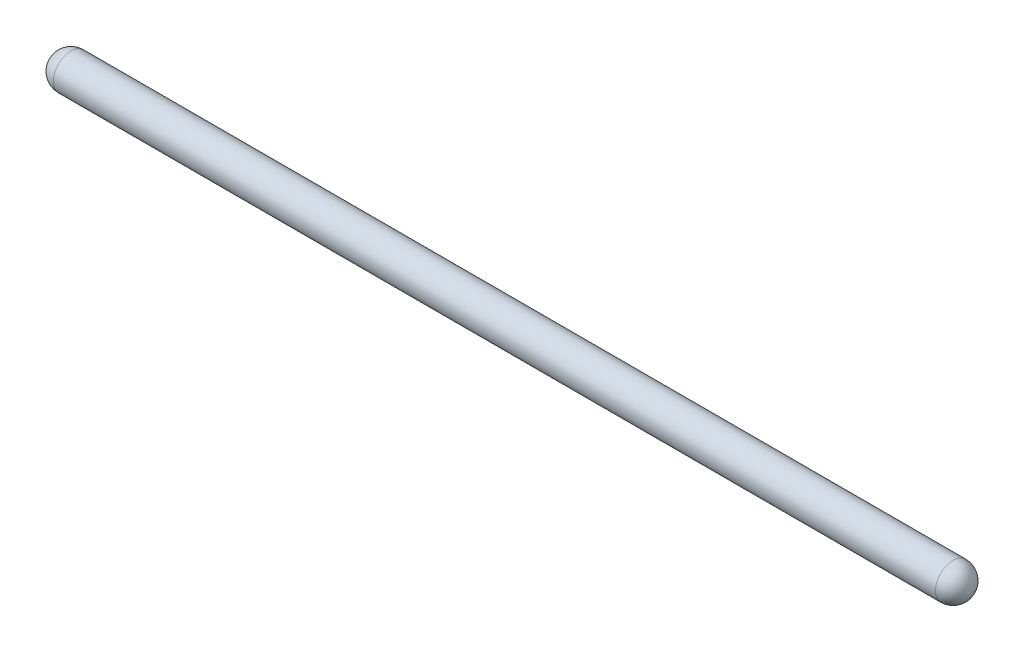
ISO-10303-21;
HEADER;
FILE_DESCRIPTION(('STEP AP214'),'2;1');
FILE_NAME('part.step','',(''),(''),'','','');
FILE_SCHEMA(('AUTOMOTIVE_DESIGN { 1 0 10303 214 1 1 1 1 }'));
ENDSEC;
DATA;
#1=APPLICATION_CONTEXT('core data for automotive mechanical design processes');
#2=APPLICATION_PROTOCOL_DEFINITION('international standard','automotive_design',2000,#1);
#3=PRODUCT_CONTEXT('',#1,'mechanical');
#4=PRODUCT('Part','Part','',(#3));
#5=PRODUCT_RELATED_PRODUCT_CATEGORY('part','',(#4));
#6=PRODUCT_DEFINITION_FORMATION('','',#4);
#7=PRODUCT_DEFINITION_CONTEXT('part definition',#1,'design');
#8=PRODUCT_DEFINITION('design','',#6,#7);
#9=PRODUCT_DEFINITION_SHAPE('','',#8);
#10=(LENGTH_UNIT() NAMED_UNIT(*) SI_UNIT(.MILLI.,.METRE.));
#11=(NAMED_UNIT(*) PLANE_ANGLE_UNIT() SI_UNIT($,.RADIAN.));
#12=(NAMED_UNIT(*) SI_UNIT($,.STERADIAN.) SOLID_ANGLE_UNIT());
#13=UNCERTAINTY_MEASURE_WITH_UNIT(LENGTH_MEASURE(1.E-05),#10,'distance_accuracy_value','');
#14=(GEOMETRIC_REPRESENTATION_CONTEXT(3) GLOBAL_UNCERTAINTY_ASSIGNED_CONTEXT((#13)) GLOBAL_UNIT_ASSIGNED_CONTEXT((#10,
#11,#12)) REPRESENTATION_CONTEXT('',''));
#15=CARTESIAN_POINT('',(0.,0.,0.));
#16=DIRECTION('',(0.,0.,1.));
#17=DIRECTION('',(1.,0.,0.));
#18=AXIS2_PLACEMENT_3D('',#15,#16,#17);
#19=CARTESIAN_POINT('',(41.275,0.,0.));
#20=DIRECTION('',(-1.,0.,0.));
#21=DIRECTION('',(0.,0.,1.));
#22=AXIS2_PLACEMENT_3D('',#19,#20,#21);
#23=CYLINDRICAL_SURFACE('',#22,0.79375);
#24=CARTESIAN_POINT('',(40.48125,0.,0.));
#25=DIRECTION('',(-1.,0.,0.));
#26=DIRECTION('',(0.,0.,1.));
#27=AXIS2_PLACEMENT_3D('',#24,#25,#26);
#28=CIRCLE('',#27,0.79375);
#29=CARTESIAN_POINT('',(40.48125,0.,0.79375));
#30=VERTEX_POINT('',#29);
#31=EDGE_CURVE('E10',#30,#30,#28,.T.);
#32=ORIENTED_EDGE('',*,*,#31,.T.);
#33=EDGE_LOOP('',(#32));
#34=FACE_BOUND('',#33,.T.);
#35=CARTESIAN_POINT('',(0.793750000000003,0.,0.));
#36=DIRECTION('',(-1.,0.,0.));
#37=DIRECTION('',(0.,0.,1.));
#38=AXIS2_PLACEMENT_3D('',#35,#36,#37);
#39=CIRCLE('',#38,0.79375);
#40=CARTESIAN_POINT('',(0.793750000000003,0.,0.79375));
#41=VERTEX_POINT('',#40);
#42=EDGE_CURVE('E38',#41,#41,#39,.F.);
#43=ORIENTED_EDGE('',*,*,#42,.T.);
#44=EDGE_LOOP('',(#43));
#45=FACE_BOUND('',#44,.T.);
#46=ADVANCED_FACE('F31',(#34,#45),#23,.T.);
#47=CARTESIAN_POINT('',(40.48125,0.,0.));
#48=DIRECTION('',(0.,0.,1.));
#49=DIRECTION('',(1.,0.,0.));
#50=AXIS2_PLACEMENT_3D('',#47,#48,#49);
#51=SPHERICAL_SURFACE('',#50,0.79375);
#52=CARTESIAN_POINT('',(40.48125,0.,0.));
#53=DIRECTION('',(-1.,0.,0.));
#54=DIRECTION('',(0.,0.,1.));
#55=AXIS2_PLACEMENT_3D('',#52,#53,#54);
#56=SPHERICAL_SURFACE('',#55,0.79375);
#57=ORIENTED_EDGE('',*,*,#31,.F.);
#58=EDGE_LOOP('',(#57));
#59=FACE_BOUND('',#58,.T.);
#60=ADVANCED_FACE('F46',(#59),#56,.T.);
#61=CARTESIAN_POINT('',(0.793750000000003,0.,0.));
#62=DIRECTION('',(0.,0.,1.));
#63=DIRECTION('',(1.,0.,0.));
#64=AXIS2_PLACEMENT_3D('',#61,#62,#63);
#65=SPHERICAL_SURFACE('',#64,0.79375);
#66=CARTESIAN_POINT('',(0.793750000000003,0.,0.));
#67=DIRECTION('',(-1.,0.,0.));
#68=DIRECTION('',(0.,0.,1.));
#69=AXIS2_PLACEMENT_3D('',#66,#67,#68);
#70=SPHERICAL_SURFACE('',#69,0.79375);
#71=ORIENTED_EDGE('',*,*,#42,.F.);
#72=EDGE_LOOP('',(#71));
#73=FACE_BOUND('',#72,.T.);
#74=ADVANCED_FACE('F33',(#73),#70,.T.);
#75=CLOSED_SHELL('',(#46,#60,#74));
#76=MANIFOLD_SOLID_BREP('B2',#75);
#77=ADVANCED_BREP_SHAPE_REPRESENTATION('',(#18,#76),#14);
#78=SHAPE_DEFINITION_REPRESENTATION(#9,#77);
ENDSEC;
END-ISO-10303-21;
